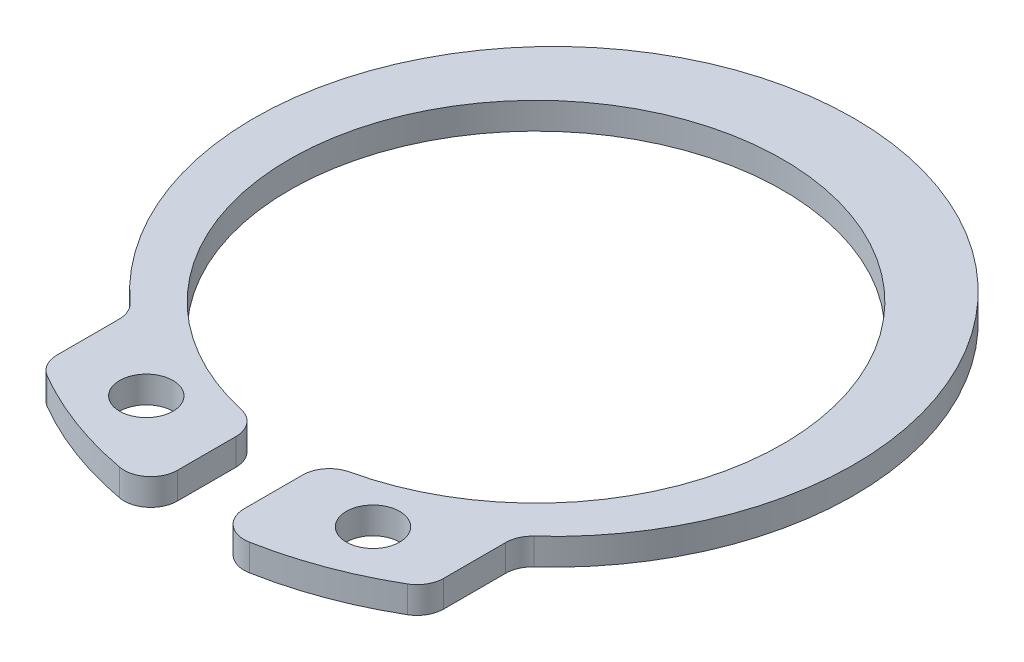
ISO-10303-21;
HEADER;
FILE_DESCRIPTION(('STEP AP214'),'2;1');
FILE_NAME('part.step','',(''),(''),'','','');
FILE_SCHEMA(('AUTOMOTIVE_DESIGN { 1 0 10303 214 1 1 1 1 }'));
ENDSEC;
DATA;
#1=APPLICATION_CONTEXT('core data for automotive mechanical design processes');
#2=APPLICATION_PROTOCOL_DEFINITION('international standard','automotive_design',2000,#1);
#3=PRODUCT_CONTEXT('',#1,'mechanical');
#4=PRODUCT('Part','Part','',(#3));
#5=PRODUCT_RELATED_PRODUCT_CATEGORY('part','',(#4));
#6=PRODUCT_DEFINITION_FORMATION('','',#4);
#7=PRODUCT_DEFINITION_CONTEXT('part definition',#1,'design');
#8=PRODUCT_DEFINITION('design','',#6,#7);
#9=PRODUCT_DEFINITION_SHAPE('','',#8);
#10=(LENGTH_UNIT() NAMED_UNIT(*) SI_UNIT(.MILLI.,.METRE.));
#11=(NAMED_UNIT(*) PLANE_ANGLE_UNIT() SI_UNIT($,.RADIAN.));
#12=(NAMED_UNIT(*) SI_UNIT($,.STERADIAN.) SOLID_ANGLE_UNIT());
#13=UNCERTAINTY_MEASURE_WITH_UNIT(LENGTH_MEASURE(1.E-05),#10,'distance_accuracy_value','');
#14=(GEOMETRIC_REPRESENTATION_CONTEXT(3) GLOBAL_UNCERTAINTY_ASSIGNED_CONTEXT((#13)) GLOBAL_UNIT_ASSIGNED_CONTEXT((#10,
#11,#12)) REPRESENTATION_CONTEXT('',''));
#15=CARTESIAN_POINT('',(0.,0.,0.));
#16=DIRECTION('',(0.,0.,1.));
#17=DIRECTION('',(1.,0.,0.));
#18=AXIS2_PLACEMENT_3D('',#15,#16,#17);
#19=CARTESIAN_POINT('',(0.,0.5,-0.67));
#20=DIRECTION('',(0.,1.,0.));
#21=DIRECTION('',(0.,0.,1.));
#22=AXIS2_PLACEMENT_3D('',#19,#20,#21);
#23=PLANE('',#22);
#24=CARTESIAN_POINT('',(-4.25,0.5,10.3623115181894));
#25=DIRECTION('',(0.,1.,0.));
#26=DIRECTION('',(0.,0.,1.));
#27=AXIS2_PLACEMENT_3D('',#24,#25,#26);
#28=CIRCLE('',#27,1.);
#29=CARTESIAN_POINT('',(-4.25,0.5,11.3623115181894));
#30=VERTEX_POINT('',#29);
#31=EDGE_CURVE('E282',#30,#30,#28,.T.);
#32=ORIENTED_EDGE('',*,*,#31,.F.);
#33=EDGE_LOOP('',(#32));
#34=FACE_BOUND('',#33,.T.);
#35=CARTESIAN_POINT('',(0.,0.5,0.));
#36=DIRECTION('',(0.,-1.,0.));
#37=DIRECTION('',(0.,0.,1.));
#38=AXIS2_PLACEMENT_3D('',#35,#36,#37);
#39=CIRCLE('',#38,9.25);
#40=CARTESIAN_POINT('',(-2.03048780487804,0.5,9.02439024390244));
#41=VERTEX_POINT('',#40);
#42=CARTESIAN_POINT('',(2.03048780487805,0.5,9.02439024390244));
#43=VERTEX_POINT('',#42);
#44=EDGE_CURVE('E274',#41,#43,#39,.T.);
#45=ORIENTED_EDGE('',*,*,#44,.T.);
#46=CARTESIAN_POINT('',(2.25,0.5,10.));
#47=DIRECTION('',(0.,1.,0.));
#48=DIRECTION('',(0.,0.,1.));
#49=AXIS2_PLACEMENT_3D('',#46,#47,#48);
#50=CIRCLE('',#49,1.);
#51=CARTESIAN_POINT('',(1.25,0.5,10.));
#52=VERTEX_POINT('',#51);
#53=EDGE_CURVE('E209',#43,#52,#50,.T.);
#54=ORIENTED_EDGE('',*,*,#53,.T.);
#55=DIRECTION('',(0.,0.,1.));
#56=VECTOR('',#55,1.);
#57=CARTESIAN_POINT('',(1.25,0.5,13.3415703723362));
#58=LINE('',#57,#56);
#59=CARTESIAN_POINT('',(1.25,0.5,12.1941584375471));
#60=VERTEX_POINT('',#59);
#61=EDGE_CURVE('E168',#52,#60,#58,.T.);
#62=ORIENTED_EDGE('',*,*,#61,.T.);
#63=CARTESIAN_POINT('',(2.25,0.5,12.1941584375471));
#64=DIRECTION('',(0.,1.,0.));
#65=DIRECTION('',(0.,0.,1.));
#66=AXIS2_PLACEMENT_3D('',#63,#64,#65);
#67=CIRCLE('',#66,1.);
#68=CARTESIAN_POINT('',(2.43145161290323,0.5,13.1775583115428));
#69=VERTEX_POINT('',#68);
#70=EDGE_CURVE('E206',#60,#69,#67,.T.);
#71=ORIENTED_EDGE('',*,*,#70,.T.);
#72=CARTESIAN_POINT('',(0.,0.5,0.));
#73=DIRECTION('',(0.,1.,0.));
#74=DIRECTION('',(0.,0.,-1.));
#75=AXIS2_PLACEMENT_3D('',#72,#73,#74);
#76=CIRCLE('',#75,13.4);
#77=CARTESIAN_POINT('',(6.75403225806452,0.5,11.573376700731));
#78=VERTEX_POINT('',#77);
#79=EDGE_CURVE('E277',#69,#78,#76,.T.);
#80=ORIENTED_EDGE('',*,*,#79,.T.);
#81=CARTESIAN_POINT('',(6.25,0.5,10.7096918723183));
#82=DIRECTION('',(0.,1.,0.));
#83=DIRECTION('',(0.,0.,1.));
#84=AXIS2_PLACEMENT_3D('',#81,#82,#83);
#85=CIRCLE('',#84,1.);
#86=CARTESIAN_POINT('',(7.25,0.5,10.7096918723183));
#87=VERTEX_POINT('',#86);
#88=EDGE_CURVE('E56',#78,#87,#85,.T.);
#89=ORIENTED_EDGE('',*,*,#88,.T.);
#90=DIRECTION('',(0.,0.,-1.));
#91=VECTOR('',#90,1.);
#92=CARTESIAN_POINT('',(7.25,0.5,7.93232526704263));
#93=LINE('',#92,#91);
#94=CARTESIAN_POINT('',(7.25,0.5,8.38538513813742));
#95=VERTEX_POINT('',#94);
#96=EDGE_CURVE('E188',#87,#95,#93,.T.);
#97=ORIENTED_EDGE('',*,*,#96,.T.);
#98=CARTESIAN_POINT('',(8.25,0.5,8.38538513813742));
#99=DIRECTION('',(0.,1.,0.));
#100=DIRECTION('',(0.,0.,1.));
#101=AXIS2_PLACEMENT_3D('',#98,#99,#100);
#102=CIRCLE('',#101,1.);
#103=CARTESIAN_POINT('',(7.5765306122449,0.5,7.64617002482008));
#104=VERTEX_POINT('',#103);
#105=EDGE_CURVE('E11',#95,#104,#102,.F.);
#106=ORIENTED_EDGE('',*,*,#105,.T.);
#107=CARTESIAN_POINT('',(0.,0.5,-0.67));
#108=DIRECTION('',(0.,1.,0.));
#109=DIRECTION('',(0.,0.,1.));
#110=AXIS2_PLACEMENT_3D('',#107,#108,#109);
#111=CIRCLE('',#110,11.25);
#112=CARTESIAN_POINT('',(-7.5765306122449,0.5,7.64617002482008));
#113=VERTEX_POINT('',#112);
#114=EDGE_CURVE('E187',#104,#113,#111,.T.);
#115=ORIENTED_EDGE('',*,*,#114,.T.);
#116=CARTESIAN_POINT('',(-8.25,0.5,8.38538513813742));
#117=DIRECTION('',(0.,1.,0.));
#118=DIRECTION('',(0.,0.,1.));
#119=AXIS2_PLACEMENT_3D('',#116,#117,#118);
#120=CIRCLE('',#119,1.);
#121=CARTESIAN_POINT('',(-7.25,0.5,8.38538513813742));
#122=VERTEX_POINT('',#121);
#123=EDGE_CURVE('E242',#113,#122,#120,.F.);
#124=ORIENTED_EDGE('',*,*,#123,.T.);
#125=DIRECTION('',(0.,0.,1.));
#126=VECTOR('',#125,1.);
#127=CARTESIAN_POINT('',(-7.25,0.5,7.93232526704263));
#128=LINE('',#127,#126);
#129=CARTESIAN_POINT('',(-7.25,0.5,10.7096918723183));
#130=VERTEX_POINT('',#129);
#131=EDGE_CURVE('E260',#122,#130,#128,.T.);
#132=ORIENTED_EDGE('',*,*,#131,.T.);
#133=CARTESIAN_POINT('',(-6.25,0.5,10.7096918723183));
#134=DIRECTION('',(0.,1.,0.));
#135=DIRECTION('',(0.,0.,1.));
#136=AXIS2_PLACEMENT_3D('',#133,#134,#135);
#137=CIRCLE('',#136,1.);
#138=CARTESIAN_POINT('',(-6.75403225806451,0.5,11.573376700731));
#139=VERTEX_POINT('',#138);
#140=EDGE_CURVE('E200',#130,#139,#137,.T.);
#141=ORIENTED_EDGE('',*,*,#140,.T.);
#142=CARTESIAN_POINT('',(0.,0.5,0.));
#143=DIRECTION('',(0.,1.,0.));
#144=DIRECTION('',(0.,0.,1.));
#145=AXIS2_PLACEMENT_3D('',#142,#143,#144);
#146=CIRCLE('',#145,13.4);
#147=CARTESIAN_POINT('',(-2.43145161290322,0.5,13.1775583115428));
#148=VERTEX_POINT('',#147);
#149=EDGE_CURVE('E263',#139,#148,#146,.T.);
#150=ORIENTED_EDGE('',*,*,#149,.T.);
#151=CARTESIAN_POINT('',(-2.24999999999999,0.5,12.1941584375471));
#152=DIRECTION('',(0.,1.,0.));
#153=DIRECTION('',(0.,0.,1.));
#154=AXIS2_PLACEMENT_3D('',#151,#152,#153);
#155=CIRCLE('',#154,1.);
#156=CARTESIAN_POINT('',(-1.24999999999999,0.5,12.1941584375471));
#157=VERTEX_POINT('',#156);
#158=EDGE_CURVE('E204',#148,#157,#155,.T.);
#159=ORIENTED_EDGE('',*,*,#158,.T.);
#160=DIRECTION('',(0.,0.,-1.));
#161=VECTOR('',#160,1.);
#162=CARTESIAN_POINT('',(-1.24999999999999,0.5,13.3415703723362));
#163=LINE('',#162,#161);
#164=CARTESIAN_POINT('',(-1.24999999999999,0.5,10.));
#165=VERTEX_POINT('',#164);
#166=EDGE_CURVE('E271',#157,#165,#163,.T.);
#167=ORIENTED_EDGE('',*,*,#166,.T.);
#168=CARTESIAN_POINT('',(-2.24999999999999,0.5,10.));
#169=DIRECTION('',(0.,1.,0.));
#170=DIRECTION('',(0.,0.,1.));
#171=AXIS2_PLACEMENT_3D('',#168,#169,#170);
#172=CIRCLE('',#171,1.);
#173=EDGE_CURVE('E202',#165,#41,#172,.T.);
#174=ORIENTED_EDGE('',*,*,#173,.T.);
#175=EDGE_LOOP('',(#45,#54,#62,#71,#80,#89,#97,#106,#115,#124,#132,#141,#150,#159,#167,#174));
#176=FACE_BOUND('',#175,.T.);
#177=CARTESIAN_POINT('',(4.25,0.5,10.3623115181894));
#178=DIRECTION('',(0.,1.,0.));
#179=DIRECTION('',(0.,0.,-1.));
#180=AXIS2_PLACEMENT_3D('',#177,#178,#179);
#181=CIRCLE('',#180,1.);
#182=CARTESIAN_POINT('',(4.25,0.5,9.36231151818937));
#183=VERTEX_POINT('',#182);
#184=EDGE_CURVE('E488',#183,#183,#181,.T.);
#185=ORIENTED_EDGE('',*,*,#184,.F.);
#186=EDGE_LOOP('',(#185));
#187=FACE_BOUND('',#186,.T.);
#188=ADVANCED_FACE('F34',(#34,#176,#187),#23,.T.);
#189=CARTESIAN_POINT('',(0.,-0.5,-0.67));
#190=DIRECTION('',(0.,1.,0.));
#191=DIRECTION('',(0.,0.,1.));
#192=AXIS2_PLACEMENT_3D('',#189,#190,#191);
#193=PLANE('',#192);
#194=DIRECTION('',(0.,0.,1.));
#195=VECTOR('',#194,1.);
#196=CARTESIAN_POINT('',(1.25,-0.5,13.3415703723362));
#197=LINE('',#196,#195);
#198=CARTESIAN_POINT('',(1.25,-0.5,10.));
#199=VERTEX_POINT('',#198);
#200=CARTESIAN_POINT('',(1.25,-0.5,12.1941584375471));
#201=VERTEX_POINT('',#200);
#202=EDGE_CURVE('E165',#199,#201,#197,.T.);
#203=ORIENTED_EDGE('',*,*,#202,.F.);
#204=CARTESIAN_POINT('',(2.25,-0.5,10.));
#205=DIRECTION('',(0.,1.,0.));
#206=DIRECTION('',(0.,0.,1.));
#207=AXIS2_PLACEMENT_3D('',#204,#205,#206);
#208=CIRCLE('',#207,1.);
#209=CARTESIAN_POINT('',(2.03048780487805,-0.5,9.02439024390244));
#210=VERTEX_POINT('',#209);
#211=EDGE_CURVE('E148',#199,#210,#208,.F.);
#212=ORIENTED_EDGE('',*,*,#211,.T.);
#213=CARTESIAN_POINT('',(0.,-0.5,0.));
#214=DIRECTION('',(0.,-1.,0.));
#215=DIRECTION('',(0.,0.,1.));
#216=AXIS2_PLACEMENT_3D('',#213,#214,#215);
#217=CIRCLE('',#216,9.25);
#218=CARTESIAN_POINT('',(-2.03048780487804,-0.5,9.02439024390244));
#219=VERTEX_POINT('',#218);
#220=EDGE_CURVE('E177',#219,#210,#217,.T.);
#221=ORIENTED_EDGE('',*,*,#220,.F.);
#222=CARTESIAN_POINT('',(-2.24999999999999,-0.5,10.));
#223=DIRECTION('',(0.,1.,0.));
#224=DIRECTION('',(0.,0.,1.));
#225=AXIS2_PLACEMENT_3D('',#222,#223,#224);
#226=CIRCLE('',#225,1.);
#227=CARTESIAN_POINT('',(-1.24999999999999,-0.5,10.));
#228=VERTEX_POINT('',#227);
#229=EDGE_CURVE('E191',#219,#228,#226,.F.);
#230=ORIENTED_EDGE('',*,*,#229,.T.);
#231=DIRECTION('',(0.,0.,-1.));
#232=VECTOR('',#231,1.);
#233=CARTESIAN_POINT('',(-1.24999999999999,-0.5,13.3415703723362));
#234=LINE('',#233,#232);
#235=CARTESIAN_POINT('',(-1.24999999999999,-0.5,12.1941584375471));
#236=VERTEX_POINT('',#235);
#237=EDGE_CURVE('E182',#236,#228,#234,.T.);
#238=ORIENTED_EDGE('',*,*,#237,.F.);
#239=CARTESIAN_POINT('',(-2.24999999999999,-0.5,12.1941584375471));
#240=DIRECTION('',(0.,1.,0.));
#241=DIRECTION('',(0.,0.,1.));
#242=AXIS2_PLACEMENT_3D('',#239,#240,#241);
#243=CIRCLE('',#242,1.);
#244=CARTESIAN_POINT('',(-2.43145161290322,-0.5,13.1775583115428));
#245=VERTEX_POINT('',#244);
#246=EDGE_CURVE('E193',#236,#245,#243,.F.);
#247=ORIENTED_EDGE('',*,*,#246,.T.);
#248=CARTESIAN_POINT('',(0.,-0.5,0.));
#249=DIRECTION('',(0.,1.,0.));
#250=DIRECTION('',(0.,0.,1.));
#251=AXIS2_PLACEMENT_3D('',#248,#249,#250);
#252=CIRCLE('',#251,13.4);
#253=CARTESIAN_POINT('',(-6.75403225806451,-0.5,11.573376700731));
#254=VERTEX_POINT('',#253);
#255=EDGE_CURVE('E285',#254,#245,#252,.T.);
#256=ORIENTED_EDGE('',*,*,#255,.F.);
#257=CARTESIAN_POINT('',(-6.25,-0.5,10.7096918723183));
#258=DIRECTION('',(0.,1.,0.));
#259=DIRECTION('',(0.,0.,1.));
#260=AXIS2_PLACEMENT_3D('',#257,#258,#259);
#261=CIRCLE('',#260,1.);
#262=CARTESIAN_POINT('',(-7.25,-0.5,10.7096918723183));
#263=VERTEX_POINT('',#262);
#264=EDGE_CURVE('E169',#254,#263,#261,.F.);
#265=ORIENTED_EDGE('',*,*,#264,.T.);
#266=DIRECTION('',(0.,0.,1.));
#267=VECTOR('',#266,1.);
#268=CARTESIAN_POINT('',(-7.25,-0.5,7.93232526704263));
#269=LINE('',#268,#267);
#270=CARTESIAN_POINT('',(-7.25,-0.5,8.38538513813742));
#271=VERTEX_POINT('',#270);
#272=EDGE_CURVE('E281',#271,#263,#269,.T.);
#273=ORIENTED_EDGE('',*,*,#272,.F.);
#274=CARTESIAN_POINT('',(-8.25,-0.5,8.38538513813742));
#275=DIRECTION('',(0.,1.,0.));
#276=DIRECTION('',(0.,0.,1.));
#277=AXIS2_PLACEMENT_3D('',#274,#275,#276);
#278=CIRCLE('',#277,1.);
#279=CARTESIAN_POINT('',(-7.5765306122449,-0.5,7.64617002482008));
#280=VERTEX_POINT('',#279);
#281=EDGE_CURVE('E240',#271,#280,#278,.T.);
#282=ORIENTED_EDGE('',*,*,#281,.T.);
#283=CARTESIAN_POINT('',(0.,-0.5,-0.67));
#284=DIRECTION('',(0.,1.,0.));
#285=DIRECTION('',(0.,0.,1.));
#286=AXIS2_PLACEMENT_3D('',#283,#284,#285);
#287=CIRCLE('',#286,11.25);
#288=CARTESIAN_POINT('',(7.5765306122449,-0.5,7.64617002482008));
#289=VERTEX_POINT('',#288);
#290=EDGE_CURVE('E246',#289,#280,#287,.T.);
#291=ORIENTED_EDGE('',*,*,#290,.F.);
#292=CARTESIAN_POINT('',(8.25,-0.5,8.38538513813742));
#293=DIRECTION('',(0.,1.,0.));
#294=DIRECTION('',(0.,0.,1.));
#295=AXIS2_PLACEMENT_3D('',#292,#293,#294);
#296=CIRCLE('',#295,1.);
#297=CARTESIAN_POINT('',(7.25,-0.5,8.38538513813742));
#298=VERTEX_POINT('',#297);
#299=EDGE_CURVE('E42',#289,#298,#296,.T.);
#300=ORIENTED_EDGE('',*,*,#299,.T.);
#301=DIRECTION('',(0.,0.,-1.));
#302=VECTOR('',#301,1.);
#303=CARTESIAN_POINT('',(7.25,-0.5,7.93232526704263));
#304=LINE('',#303,#302);
#305=CARTESIAN_POINT('',(7.25,-0.5,10.7096918723183));
#306=VERTEX_POINT('',#305);
#307=EDGE_CURVE('E180',#306,#298,#304,.T.);
#308=ORIENTED_EDGE('',*,*,#307,.F.);
#309=CARTESIAN_POINT('',(6.25,-0.5,10.7096918723183));
#310=DIRECTION('',(0.,1.,0.));
#311=DIRECTION('',(0.,0.,1.));
#312=AXIS2_PLACEMENT_3D('',#309,#310,#311);
#313=CIRCLE('',#312,1.);
#314=CARTESIAN_POINT('',(6.75403225806452,-0.5,11.573376700731));
#315=VERTEX_POINT('',#314);
#316=EDGE_CURVE('E159',#306,#315,#313,.F.);
#317=ORIENTED_EDGE('',*,*,#316,.T.);
#318=CARTESIAN_POINT('',(0.,-0.5,0.));
#319=DIRECTION('',(0.,1.,0.));
#320=DIRECTION('',(0.,0.,-1.));
#321=AXIS2_PLACEMENT_3D('',#318,#319,#320);
#322=CIRCLE('',#321,13.4);
#323=CARTESIAN_POINT('',(2.43145161290323,-0.5,13.1775583115428));
#324=VERTEX_POINT('',#323);
#325=EDGE_CURVE('E176',#324,#315,#322,.T.);
#326=ORIENTED_EDGE('',*,*,#325,.F.);
#327=CARTESIAN_POINT('',(2.25,-0.5,12.1941584375471));
#328=DIRECTION('',(0.,1.,0.));
#329=DIRECTION('',(0.,0.,1.));
#330=AXIS2_PLACEMENT_3D('',#327,#328,#329);
#331=CIRCLE('',#330,1.);
#332=EDGE_CURVE('E175',#324,#201,#331,.F.);
#333=ORIENTED_EDGE('',*,*,#332,.T.);
#334=EDGE_LOOP('',(#203,#212,#221,#230,#238,#247,#256,#265,#273,#282,#291,#300,#308,#317,#326,#333));
#335=FACE_BOUND('',#334,.T.);
#336=CARTESIAN_POINT('',(-4.25,-0.5,10.3623115181894));
#337=DIRECTION('',(0.,1.,0.));
#338=DIRECTION('',(0.,0.,1.));
#339=AXIS2_PLACEMENT_3D('',#336,#337,#338);
#340=CIRCLE('',#339,1.);
#341=CARTESIAN_POINT('',(-4.25,-0.5,11.3623115181894));
#342=VERTEX_POINT('',#341);
#343=EDGE_CURVE('E266',#342,#342,#340,.T.);
#344=ORIENTED_EDGE('',*,*,#343,.T.);
#345=EDGE_LOOP('',(#344));
#346=FACE_BOUND('',#345,.T.);
#347=CARTESIAN_POINT('',(4.25,-0.5,10.3623115181894));
#348=DIRECTION('',(0.,1.,0.));
#349=DIRECTION('',(0.,0.,-1.));
#350=AXIS2_PLACEMENT_3D('',#347,#348,#349);
#351=CIRCLE('',#350,1.);
#352=CARTESIAN_POINT('',(4.25,-0.5,9.36231151818937));
#353=VERTEX_POINT('',#352);
#354=EDGE_CURVE('E490',#353,#353,#351,.T.);
#355=ORIENTED_EDGE('',*,*,#354,.T.);
#356=EDGE_LOOP('',(#355));
#357=FACE_BOUND('',#356,.T.);
#358=ADVANCED_FACE('F172',(#335,#346,#357),#193,.F.);
#359=CARTESIAN_POINT('',(0.,0.5,-0.67));
#360=DIRECTION('',(0.,-1.,0.));
#361=DIRECTION('',(0.,0.,-1.));
#362=AXIS2_PLACEMENT_3D('',#359,#360,#361);
#363=CYLINDRICAL_SURFACE('',#362,11.25);
#364=ORIENTED_EDGE('',*,*,#290,.T.);
#365=DIRECTION('',(0.,-1.,0.));
#366=VECTOR('',#365,1.);
#367=CARTESIAN_POINT('',(-7.5765306122449,0.5,7.64617002482008));
#368=LINE('',#367,#366);
#369=EDGE_CURVE('E238',#280,#113,#368,.F.);
#370=ORIENTED_EDGE('',*,*,#369,.T.);
#371=ORIENTED_EDGE('',*,*,#114,.F.);
#372=DIRECTION('',(0.,-1.,0.));
#373=VECTOR('',#372,1.);
#374=CARTESIAN_POINT('',(7.5765306122449,0.5,7.64617002482008));
#375=LINE('',#374,#373);
#376=EDGE_CURVE('E235',#104,#289,#375,.T.);
#377=ORIENTED_EDGE('',*,*,#376,.T.);
#378=EDGE_LOOP('',(#364,#370,#371,#377));
#379=FACE_BOUND('',#378,.T.);
#380=ADVANCED_FACE('F258',(#379),#363,.T.);
#381=CARTESIAN_POINT('',(-7.25,0.5,7.93232526704263));
#382=DIRECTION('',(1.,0.,0.));
#383=DIRECTION('',(0.,0.,-1.));
#384=AXIS2_PLACEMENT_3D('',#381,#382,#383);
#385=PLANE('',#384);
#386=ORIENTED_EDGE('',*,*,#272,.T.);
#387=DIRECTION('',(0.,-1.,0.));
#388=VECTOR('',#387,1.);
#389=CARTESIAN_POINT('',(-7.25,0.5,10.7096918723183));
#390=LINE('',#389,#388);
#391=EDGE_CURVE('E233',#263,#130,#390,.F.);
#392=ORIENTED_EDGE('',*,*,#391,.T.);
#393=ORIENTED_EDGE('',*,*,#131,.F.);
#394=DIRECTION('',(0.,1.,0.));
#395=VECTOR('',#394,1.);
#396=CARTESIAN_POINT('',(-7.25,-0.5,8.38538513813742));
#397=LINE('',#396,#395);
#398=EDGE_CURVE('E230',#122,#271,#397,.F.);
#399=ORIENTED_EDGE('',*,*,#398,.T.);
#400=EDGE_LOOP('',(#386,#392,#393,#399));
#401=FACE_BOUND('',#400,.T.);
#402=ADVANCED_FACE('F366',(#401),#385,.F.);
#403=CARTESIAN_POINT('',(0.,0.5,0.));
#404=DIRECTION('',(0.,-1.,0.));
#405=DIRECTION('',(0.,0.,-1.));
#406=AXIS2_PLACEMENT_3D('',#403,#404,#405);
#407=CYLINDRICAL_SURFACE('',#406,13.4);
#408=ORIENTED_EDGE('',*,*,#255,.T.);
#409=DIRECTION('',(0.,-1.,0.));
#410=VECTOR('',#409,1.);
#411=CARTESIAN_POINT('',(-2.43145161290322,0.5,13.1775583115428));
#412=LINE('',#411,#410);
#413=EDGE_CURVE('E228',#245,#148,#412,.F.);
#414=ORIENTED_EDGE('',*,*,#413,.T.);
#415=ORIENTED_EDGE('',*,*,#149,.F.);
#416=DIRECTION('',(0.,-1.,0.));
#417=VECTOR('',#416,1.);
#418=CARTESIAN_POINT('',(-6.75403225806451,0.5,11.573376700731));
#419=LINE('',#418,#417);
#420=EDGE_CURVE('E225',#139,#254,#419,.T.);
#421=ORIENTED_EDGE('',*,*,#420,.T.);
#422=EDGE_LOOP('',(#408,#414,#415,#421));
#423=FACE_BOUND('',#422,.T.);
#424=ADVANCED_FACE('F309',(#423),#407,.T.);
#425=CARTESIAN_POINT('',(-1.24999999999999,0.5,13.3415703723362));
#426=DIRECTION('',(-1.,0.,0.));
#427=DIRECTION('',(0.,0.,1.));
#428=AXIS2_PLACEMENT_3D('',#425,#426,#427);
#429=PLANE('',#428);
#430=ORIENTED_EDGE('',*,*,#166,.F.);
#431=DIRECTION('',(0.,-1.,0.));
#432=VECTOR('',#431,1.);
#433=CARTESIAN_POINT('',(-1.24999999999999,0.5,12.1941584375471));
#434=LINE('',#433,#432);
#435=EDGE_CURVE('E222',#157,#236,#434,.T.);
#436=ORIENTED_EDGE('',*,*,#435,.T.);
#437=ORIENTED_EDGE('',*,*,#237,.T.);
#438=DIRECTION('',(0.,-1.,0.));
#439=VECTOR('',#438,1.);
#440=CARTESIAN_POINT('',(-1.24999999999999,0.5,10.));
#441=LINE('',#440,#439);
#442=EDGE_CURVE('E220',#228,#165,#441,.F.);
#443=ORIENTED_EDGE('',*,*,#442,.T.);
#444=EDGE_LOOP('',(#430,#436,#437,#443));
#445=FACE_BOUND('',#444,.T.);
#446=ADVANCED_FACE('F292',(#445),#429,.F.);
#447=CARTESIAN_POINT('',(0.,0.5,0.));
#448=DIRECTION('',(0.,-1.,0.));
#449=DIRECTION('',(0.,0.,-1.));
#450=AXIS2_PLACEMENT_3D('',#447,#448,#449);
#451=CYLINDRICAL_SURFACE('',#450,9.25);
#452=ORIENTED_EDGE('',*,*,#220,.T.);
#453=DIRECTION('',(0.,-1.,0.));
#454=VECTOR('',#453,1.);
#455=CARTESIAN_POINT('',(2.03048780487805,0.5,9.02439024390244));
#456=LINE('',#455,#454);
#457=EDGE_CURVE('E153',#210,#43,#456,.F.);
#458=ORIENTED_EDGE('',*,*,#457,.T.);
#459=ORIENTED_EDGE('',*,*,#44,.F.);
#460=DIRECTION('',(0.,-1.,0.));
#461=VECTOR('',#460,1.);
#462=CARTESIAN_POINT('',(-2.03048780487804,0.5,9.02439024390244));
#463=LINE('',#462,#461);
#464=EDGE_CURVE('E158',#41,#219,#463,.T.);
#465=ORIENTED_EDGE('',*,*,#464,.T.);
#466=EDGE_LOOP('',(#452,#458,#459,#465));
#467=FACE_BOUND('',#466,.T.);
#468=ADVANCED_FACE('F300',(#467),#451,.F.);
#469=CARTESIAN_POINT('',(1.25,0.5,13.3415703723362));
#470=DIRECTION('',(1.,0.,0.));
#471=DIRECTION('',(0.,0.,-1.));
#472=AXIS2_PLACEMENT_3D('',#469,#470,#471);
#473=PLANE('',#472);
#474=ORIENTED_EDGE('',*,*,#61,.F.);
#475=DIRECTION('',(0.,-1.,0.));
#476=VECTOR('',#475,1.);
#477=CARTESIAN_POINT('',(1.25,0.5,10.));
#478=LINE('',#477,#476);
#479=EDGE_CURVE('E152',#52,#199,#478,.T.);
#480=ORIENTED_EDGE('',*,*,#479,.T.);
#481=ORIENTED_EDGE('',*,*,#202,.T.);
#482=DIRECTION('',(0.,-1.,0.));
#483=VECTOR('',#482,1.);
#484=CARTESIAN_POINT('',(1.25,0.5,12.1941584375471));
#485=LINE('',#484,#483);
#486=EDGE_CURVE('E170',#201,#60,#485,.F.);
#487=ORIENTED_EDGE('',*,*,#486,.T.);
#488=EDGE_LOOP('',(#474,#480,#481,#487));
#489=FACE_BOUND('',#488,.T.);
#490=ADVANCED_FACE('F164',(#489),#473,.F.);
#491=CARTESIAN_POINT('',(0.,0.5,0.));
#492=DIRECTION('',(0.,-1.,0.));
#493=DIRECTION('',(0.,0.,-1.));
#494=AXIS2_PLACEMENT_3D('',#491,#492,#493);
#495=CYLINDRICAL_SURFACE('',#494,13.4);
#496=ORIENTED_EDGE('',*,*,#325,.T.);
#497=DIRECTION('',(0.,-1.,0.));
#498=VECTOR('',#497,1.);
#499=CARTESIAN_POINT('',(6.75403225806452,0.5,11.573376700731));
#500=LINE('',#499,#498);
#501=EDGE_CURVE('E218',#315,#78,#500,.F.);
#502=ORIENTED_EDGE('',*,*,#501,.T.);
#503=ORIENTED_EDGE('',*,*,#79,.F.);
#504=DIRECTION('',(0.,-1.,0.));
#505=VECTOR('',#504,1.);
#506=CARTESIAN_POINT('',(2.43145161290323,0.5,13.1775583115428));
#507=LINE('',#506,#505);
#508=EDGE_CURVE('E215',#69,#324,#507,.T.);
#509=ORIENTED_EDGE('',*,*,#508,.T.);
#510=EDGE_LOOP('',(#496,#502,#503,#509));
#511=FACE_BOUND('',#510,.T.);
#512=ADVANCED_FACE('F307',(#511),#495,.T.);
#513=CARTESIAN_POINT('',(7.25,0.5,7.93232526704263));
#514=DIRECTION('',(-1.,0.,0.));
#515=DIRECTION('',(0.,0.,1.));
#516=AXIS2_PLACEMENT_3D('',#513,#514,#515);
#517=PLANE('',#516);
#518=ORIENTED_EDGE('',*,*,#96,.F.);
#519=DIRECTION('',(0.,-1.,0.));
#520=VECTOR('',#519,1.);
#521=CARTESIAN_POINT('',(7.25,0.5,10.7096918723183));
#522=LINE('',#521,#520);
#523=EDGE_CURVE('E212',#87,#306,#522,.T.);
#524=ORIENTED_EDGE('',*,*,#523,.T.);
#525=ORIENTED_EDGE('',*,*,#307,.T.);
#526=DIRECTION('',(0.,1.,0.));
#527=VECTOR('',#526,1.);
#528=CARTESIAN_POINT('',(7.25,0.5,8.38538513813742));
#529=LINE('',#528,#527);
#530=EDGE_CURVE('E49',#298,#95,#529,.T.);
#531=ORIENTED_EDGE('',*,*,#530,.T.);
#532=EDGE_LOOP('',(#518,#524,#525,#531));
#533=FACE_BOUND('',#532,.T.);
#534=ADVANCED_FACE('F249',(#533),#517,.F.);
#535=CARTESIAN_POINT('',(-4.25,0.5,10.3623115181894));
#536=DIRECTION('',(0.,-1.,0.));
#537=DIRECTION('',(0.,0.,-1.));
#538=AXIS2_PLACEMENT_3D('',#535,#536,#537);
#539=CYLINDRICAL_SURFACE('',#538,1.);
#540=ORIENTED_EDGE('',*,*,#31,.T.);
#541=EDGE_LOOP('',(#540));
#542=FACE_BOUND('',#541,.T.);
#543=ORIENTED_EDGE('',*,*,#343,.F.);
#544=EDGE_LOOP('',(#543));
#545=FACE_BOUND('',#544,.T.);
#546=ADVANCED_FACE('F320',(#542,#545),#539,.F.);
#547=CARTESIAN_POINT('',(4.25,0.5,10.3623115181894));
#548=DIRECTION('',(0.,-1.,0.));
#549=DIRECTION('',(0.,0.,-1.));
#550=AXIS2_PLACEMENT_3D('',#547,#548,#549);
#551=CYLINDRICAL_SURFACE('',#550,1.);
#552=ORIENTED_EDGE('',*,*,#184,.T.);
#553=EDGE_LOOP('',(#552));
#554=FACE_BOUND('',#553,.T.);
#555=ORIENTED_EDGE('',*,*,#354,.F.);
#556=EDGE_LOOP('',(#555));
#557=FACE_BOUND('',#556,.T.);
#558=ADVANCED_FACE('F344',(#554,#557),#551,.F.);
#559=CARTESIAN_POINT('',(2.25,0.5,10.));
#560=DIRECTION('',(0.,-1.,0.));
#561=DIRECTION('',(0.,0.,-1.));
#562=AXIS2_PLACEMENT_3D('',#559,#560,#561);
#563=CYLINDRICAL_SURFACE('',#562,1.);
#564=ORIENTED_EDGE('',*,*,#53,.F.);
#565=ORIENTED_EDGE('',*,*,#457,.F.);
#566=ORIENTED_EDGE('',*,*,#211,.F.);
#567=ORIENTED_EDGE('',*,*,#479,.F.);
#568=EDGE_LOOP('',(#564,#565,#566,#567));
#569=FACE_BOUND('',#568,.T.);
#570=ADVANCED_FACE('F151',(#569),#563,.T.);
#571=CARTESIAN_POINT('',(6.25,0.5,10.7096918723183));
#572=DIRECTION('',(0.,-1.,0.));
#573=DIRECTION('',(0.,0.,-1.));
#574=AXIS2_PLACEMENT_3D('',#571,#572,#573);
#575=CYLINDRICAL_SURFACE('',#574,1.);
#576=ORIENTED_EDGE('',*,*,#88,.F.);
#577=ORIENTED_EDGE('',*,*,#501,.F.);
#578=ORIENTED_EDGE('',*,*,#316,.F.);
#579=ORIENTED_EDGE('',*,*,#523,.F.);
#580=EDGE_LOOP('',(#576,#577,#578,#579));
#581=FACE_BOUND('',#580,.T.);
#582=ADVANCED_FACE('F333',(#581),#575,.T.);
#583=CARTESIAN_POINT('',(2.25,0.5,12.1941584375471));
#584=DIRECTION('',(0.,-1.,0.));
#585=DIRECTION('',(0.,0.,-1.));
#586=AXIS2_PLACEMENT_3D('',#583,#584,#585);
#587=CYLINDRICAL_SURFACE('',#586,1.);
#588=ORIENTED_EDGE('',*,*,#70,.F.);
#589=ORIENTED_EDGE('',*,*,#486,.F.);
#590=ORIENTED_EDGE('',*,*,#332,.F.);
#591=ORIENTED_EDGE('',*,*,#508,.F.);
#592=EDGE_LOOP('',(#588,#589,#590,#591));
#593=FACE_BOUND('',#592,.T.);
#594=ADVANCED_FACE('F335',(#593),#587,.T.);
#595=CARTESIAN_POINT('',(-2.24999999999999,0.5,12.1941584375471));
#596=DIRECTION('',(0.,-1.,0.));
#597=DIRECTION('',(0.,0.,-1.));
#598=AXIS2_PLACEMENT_3D('',#595,#596,#597);
#599=CYLINDRICAL_SURFACE('',#598,1.);
#600=ORIENTED_EDGE('',*,*,#158,.F.);
#601=ORIENTED_EDGE('',*,*,#413,.F.);
#602=ORIENTED_EDGE('',*,*,#246,.F.);
#603=ORIENTED_EDGE('',*,*,#435,.F.);
#604=EDGE_LOOP('',(#600,#601,#602,#603));
#605=FACE_BOUND('',#604,.T.);
#606=ADVANCED_FACE('F341',(#605),#599,.T.);
#607=CARTESIAN_POINT('',(-2.24999999999999,0.5,10.));
#608=DIRECTION('',(0.,-1.,0.));
#609=DIRECTION('',(0.,0.,-1.));
#610=AXIS2_PLACEMENT_3D('',#607,#608,#609);
#611=CYLINDRICAL_SURFACE('',#610,1.);
#612=ORIENTED_EDGE('',*,*,#173,.F.);
#613=ORIENTED_EDGE('',*,*,#442,.F.);
#614=ORIENTED_EDGE('',*,*,#229,.F.);
#615=ORIENTED_EDGE('',*,*,#464,.F.);
#616=EDGE_LOOP('',(#612,#613,#614,#615));
#617=FACE_BOUND('',#616,.T.);
#618=ADVANCED_FACE('F296',(#617),#611,.T.);
#619=CARTESIAN_POINT('',(-6.25,0.5,10.7096918723183));
#620=DIRECTION('',(0.,-1.,0.));
#621=DIRECTION('',(0.,0.,-1.));
#622=AXIS2_PLACEMENT_3D('',#619,#620,#621);
#623=CYLINDRICAL_SURFACE('',#622,1.);
#624=ORIENTED_EDGE('',*,*,#140,.F.);
#625=ORIENTED_EDGE('',*,*,#391,.F.);
#626=ORIENTED_EDGE('',*,*,#264,.F.);
#627=ORIENTED_EDGE('',*,*,#420,.F.);
#628=EDGE_LOOP('',(#624,#625,#626,#627));
#629=FACE_BOUND('',#628,.T.);
#630=ADVANCED_FACE('F353',(#629),#623,.T.);
#631=CARTESIAN_POINT('',(-8.25,0.5,8.38538513813742));
#632=DIRECTION('',(0.,-1.,0.));
#633=DIRECTION('',(0.,0.,-1.));
#634=AXIS2_PLACEMENT_3D('',#631,#632,#633);
#635=CYLINDRICAL_SURFACE('',#634,1.);
#636=ORIENTED_EDGE('',*,*,#123,.F.);
#637=ORIENTED_EDGE('',*,*,#369,.F.);
#638=ORIENTED_EDGE('',*,*,#281,.F.);
#639=ORIENTED_EDGE('',*,*,#398,.F.);
#640=EDGE_LOOP('',(#636,#637,#638,#639));
#641=FACE_BOUND('',#640,.T.);
#642=ADVANCED_FACE('F355',(#641),#635,.F.);
#643=CARTESIAN_POINT('',(8.25,0.5,8.38538513813742));
#644=DIRECTION('',(0.,-1.,0.));
#645=DIRECTION('',(0.,0.,-1.));
#646=AXIS2_PLACEMENT_3D('',#643,#644,#645);
#647=CYLINDRICAL_SURFACE('',#646,1.);
#648=ORIENTED_EDGE('',*,*,#105,.F.);
#649=ORIENTED_EDGE('',*,*,#530,.F.);
#650=ORIENTED_EDGE('',*,*,#299,.F.);
#651=ORIENTED_EDGE('',*,*,#376,.F.);
#652=EDGE_LOOP('',(#648,#649,#650,#651));
#653=FACE_BOUND('',#652,.T.);
#654=ADVANCED_FACE('F36',(#653),#647,.F.);
#655=CLOSED_SHELL('',(#188,#358,#380,#402,#424,#446,#468,#490,#512,#534,#546,#558,#570,#582,
#594,#606,#618,#630,#642,#654));
#656=MANIFOLD_SOLID_BREP('B2',#655);
#657=ADVANCED_BREP_SHAPE_REPRESENTATION('',(#18,#656),#14);
#658=SHAPE_DEFINITION_REPRESENTATION(#9,#657);
ENDSEC;
END-ISO-10303-21;
